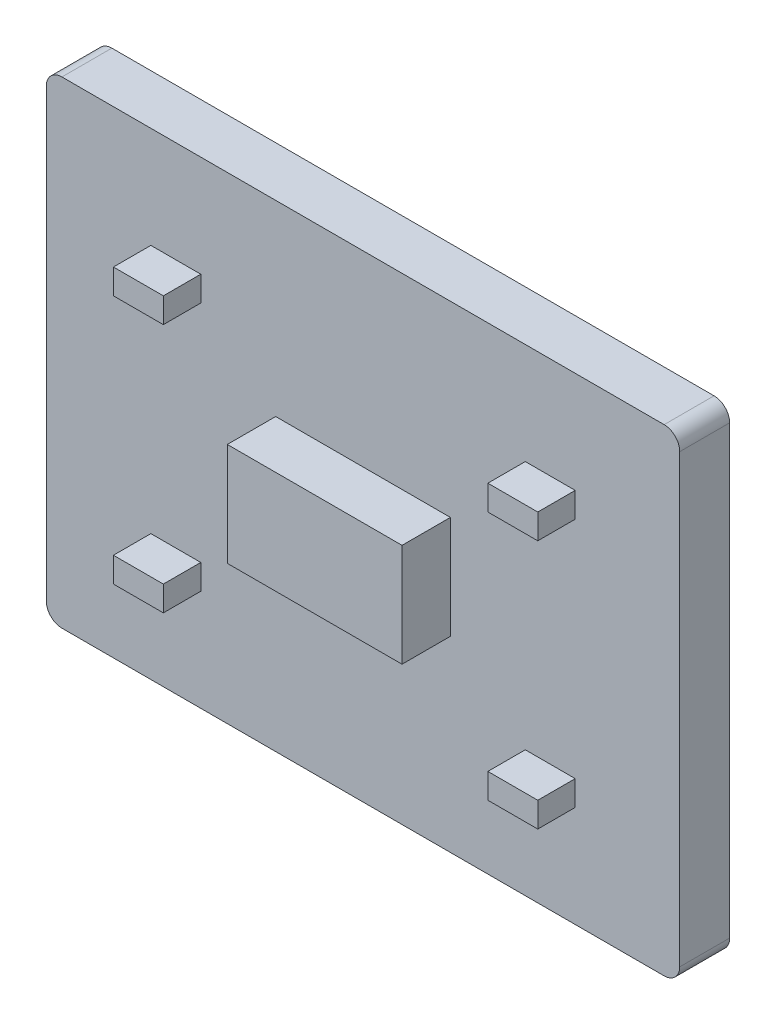
ISO-10303-21;
HEADER;
FILE_DESCRIPTION(('STEP AP214'),'2;1');
FILE_NAME('part.step','',(''),(''),'','','');
FILE_SCHEMA(('AUTOMOTIVE_DESIGN { 1 0 10303 214 1 1 1 1 }'));
ENDSEC;
DATA;
#1=APPLICATION_CONTEXT('core data for automotive mechanical design processes');
#2=APPLICATION_PROTOCOL_DEFINITION('international standard','automotive_design',2000,#1);
#3=PRODUCT_CONTEXT('',#1,'mechanical');
#4=PRODUCT('Part','Part','',(#3));
#5=PRODUCT_RELATED_PRODUCT_CATEGORY('part','',(#4));
#6=PRODUCT_DEFINITION_FORMATION('','',#4);
#7=PRODUCT_DEFINITION_CONTEXT('part definition',#1,'design');
#8=PRODUCT_DEFINITION('design','',#6,#7);
#9=PRODUCT_DEFINITION_SHAPE('','',#8);
#10=(LENGTH_UNIT() NAMED_UNIT(*) SI_UNIT(.MILLI.,.METRE.));
#11=(NAMED_UNIT(*) PLANE_ANGLE_UNIT() SI_UNIT($,.RADIAN.));
#12=(NAMED_UNIT(*) SI_UNIT($,.STERADIAN.) SOLID_ANGLE_UNIT());
#13=UNCERTAINTY_MEASURE_WITH_UNIT(LENGTH_MEASURE(1.E-05),#10,'distance_accuracy_value','');
#14=(GEOMETRIC_REPRESENTATION_CONTEXT(3) GLOBAL_UNCERTAINTY_ASSIGNED_CONTEXT((#13)) GLOBAL_UNIT_ASSIGNED_CONTEXT((#10,
#11,#12)) REPRESENTATION_CONTEXT('',''));
#15=CARTESIAN_POINT('',(0.,0.,0.));
#16=DIRECTION('',(0.,0.,1.));
#17=DIRECTION('',(1.,0.,0.));
#18=AXIS2_PLACEMENT_3D('',#15,#16,#17);
#19=CARTESIAN_POINT('',(19.35,3.85,-2.));
#20=DIRECTION('',(0.,0.,1.));
#21=DIRECTION('',(1.,0.,0.));
#22=AXIS2_PLACEMENT_3D('',#19,#20,#21);
#23=PLANE('',#22);
#24=DIRECTION('',(0.,-1.,0.));
#25=VECTOR('',#24,1.);
#26=CARTESIAN_POINT('',(26.2,12.65,-2.));
#27=LINE('',#26,#25);
#28=CARTESIAN_POINT('',(26.2,12.65,-2.));
#29=VERTEX_POINT('',#28);
#30=CARTESIAN_POINT('',(26.2,9.35,-2.));
#31=VERTEX_POINT('',#30);
#32=EDGE_CURVE('E347',#29,#31,#27,.T.);
#33=ORIENTED_EDGE('',*,*,#32,.F.);
#34=DIRECTION('',(-1.,0.,0.));
#35=VECTOR('',#34,1.);
#36=CARTESIAN_POINT('',(31.8,12.65,-2.));
#37=LINE('',#36,#35);
#38=CARTESIAN_POINT('',(31.8,12.65,-2.));
#39=VERTEX_POINT('',#38);
#40=EDGE_CURVE('E354',#39,#29,#37,.T.);
#41=ORIENTED_EDGE('',*,*,#40,.F.);
#42=DIRECTION('',(0.,1.,0.));
#43=VECTOR('',#42,1.);
#44=CARTESIAN_POINT('',(31.8,9.35,-2.));
#45=LINE('',#44,#43);
#46=CARTESIAN_POINT('',(31.8,9.35,-2.));
#47=VERTEX_POINT('',#46);
#48=EDGE_CURVE('E361',#47,#39,#45,.T.);
#49=ORIENTED_EDGE('',*,*,#48,.F.);
#50=DIRECTION('',(1.,0.,0.));
#51=VECTOR('',#50,1.);
#52=CARTESIAN_POINT('',(26.2,9.35,-2.));
#53=LINE('',#52,#51);
#54=EDGE_CURVE('E358',#31,#47,#53,.T.);
#55=ORIENTED_EDGE('',*,*,#54,.F.);
#56=EDGE_LOOP('',(#33,#41,#49,#55));
#57=FACE_BOUND('',#56,.T.);
#58=CARTESIAN_POINT('',(19.35,3.85,-2.));
#59=DIRECTION('',(0.,0.,1.));
#60=DIRECTION('',(1.,0.,0.));
#61=AXIS2_PLACEMENT_3D('',#58,#59,#60);
#62=CIRCLE('',#61,0.500000000000003);
#63=CARTESIAN_POINT('',(18.85,3.85,-2.));
#64=VERTEX_POINT('',#63);
#65=CARTESIAN_POINT('',(19.35,3.35,-2.));
#66=VERTEX_POINT('',#65);
#67=EDGE_CURVE('E377',#64,#66,#62,.T.);
#68=ORIENTED_EDGE('',*,*,#67,.T.);
#69=DIRECTION('',(1.,0.,0.));
#70=VECTOR('',#69,1.);
#71=CARTESIAN_POINT('',(19.35,3.35,-2.));
#72=LINE('',#71,#70);
#73=CARTESIAN_POINT('',(38.65,3.35,-2.));
#74=VERTEX_POINT('',#73);
#75=EDGE_CURVE('E406',#66,#74,#72,.T.);
#76=ORIENTED_EDGE('',*,*,#75,.T.);
#77=CARTESIAN_POINT('',(38.65,3.84999999999999,-2.));
#78=DIRECTION('',(0.,0.,1.));
#79=DIRECTION('',(1.,0.,0.));
#80=AXIS2_PLACEMENT_3D('',#77,#78,#79);
#81=CIRCLE('',#80,0.499999999999993);
#82=CARTESIAN_POINT('',(39.15,3.85,-2.));
#83=VERTEX_POINT('',#82);
#84=EDGE_CURVE('E407',#74,#83,#81,.T.);
#85=ORIENTED_EDGE('',*,*,#84,.T.);
#86=DIRECTION('',(0.,1.,0.));
#87=VECTOR('',#86,1.);
#88=CARTESIAN_POINT('',(39.15,3.85,-2.));
#89=LINE('',#88,#87);
#90=CARTESIAN_POINT('',(39.15,18.15,-2.));
#91=VERTEX_POINT('',#90);
#92=EDGE_CURVE('E414',#83,#91,#89,.T.);
#93=ORIENTED_EDGE('',*,*,#92,.T.);
#94=CARTESIAN_POINT('',(38.65,18.15,-2.));
#95=DIRECTION('',(0.,0.,1.));
#96=DIRECTION('',(1.,0.,0.));
#97=AXIS2_PLACEMENT_3D('',#94,#95,#96);
#98=CIRCLE('',#97,0.499999999999997);
#99=CARTESIAN_POINT('',(38.65,18.65,-2.));
#100=VERTEX_POINT('',#99);
#101=EDGE_CURVE('E418',#91,#100,#98,.T.);
#102=ORIENTED_EDGE('',*,*,#101,.T.);
#103=DIRECTION('',(-1.,0.,0.));
#104=VECTOR('',#103,1.);
#105=CARTESIAN_POINT('',(38.65,18.65,-2.));
#106=LINE('',#105,#104);
#107=CARTESIAN_POINT('',(19.35,18.65,-2.));
#108=VERTEX_POINT('',#107);
#109=EDGE_CURVE('E420',#100,#108,#106,.T.);
#110=ORIENTED_EDGE('',*,*,#109,.T.);
#111=CARTESIAN_POINT('',(19.35,18.15,-2.));
#112=DIRECTION('',(0.,0.,1.));
#113=DIRECTION('',(1.,0.,0.));
#114=AXIS2_PLACEMENT_3D('',#111,#112,#113);
#115=CIRCLE('',#114,0.500000000000007);
#116=CARTESIAN_POINT('',(18.85,18.15,-2.));
#117=VERTEX_POINT('',#116);
#118=EDGE_CURVE('E425',#108,#117,#115,.T.);
#119=ORIENTED_EDGE('',*,*,#118,.T.);
#120=DIRECTION('',(0.,-1.,0.));
#121=VECTOR('',#120,1.);
#122=CARTESIAN_POINT('',(18.85,18.15,-2.));
#123=LINE('',#122,#121);
#124=EDGE_CURVE('E383',#117,#64,#123,.T.);
#125=ORIENTED_EDGE('',*,*,#124,.T.);
#126=EDGE_LOOP('',(#68,#76,#85,#93,#102,#110,#119,#125));
#127=FACE_BOUND('',#126,.T.);
#128=DIRECTION('',(1.,0.,0.));
#129=VECTOR('',#128,1.);
#130=CARTESIAN_POINT('',(22.2,6.6,-2.));
#131=LINE('',#130,#129);
#132=CARTESIAN_POINT('',(22.2,6.6,-2.));
#133=VERTEX_POINT('',#132);
#134=CARTESIAN_POINT('',(23.8,6.6,-2.));
#135=VERTEX_POINT('',#134);
#136=EDGE_CURVE('E332',#133,#135,#131,.T.);
#137=ORIENTED_EDGE('',*,*,#136,.F.);
#138=DIRECTION('',(0.,-1.,0.));
#139=VECTOR('',#138,1.);
#140=CARTESIAN_POINT('',(22.2,7.4,-2.));
#141=LINE('',#140,#139);
#142=CARTESIAN_POINT('',(22.2,7.4,-2.));
#143=VERTEX_POINT('',#142);
#144=EDGE_CURVE('E290',#143,#133,#141,.T.);
#145=ORIENTED_EDGE('',*,*,#144,.F.);
#146=DIRECTION('',(-1.,0.,0.));
#147=VECTOR('',#146,1.);
#148=CARTESIAN_POINT('',(23.8,7.4,-2.));
#149=LINE('',#148,#147);
#150=CARTESIAN_POINT('',(23.8,7.4,-2.));
#151=VERTEX_POINT('',#150);
#152=EDGE_CURVE('E325',#151,#143,#149,.T.);
#153=ORIENTED_EDGE('',*,*,#152,.F.);
#154=DIRECTION('',(0.,1.,0.));
#155=VECTOR('',#154,1.);
#156=CARTESIAN_POINT('',(23.8,6.6,-2.));
#157=LINE('',#156,#155);
#158=EDGE_CURVE('E334',#135,#151,#157,.T.);
#159=ORIENTED_EDGE('',*,*,#158,.F.);
#160=EDGE_LOOP('',(#137,#145,#153,#159));
#161=FACE_BOUND('',#160,.T.);
#162=DIRECTION('',(1.,0.,0.));
#163=VECTOR('',#162,1.);
#164=CARTESIAN_POINT('',(34.2,14.6,-2.));
#165=LINE('',#164,#163);
#166=CARTESIAN_POINT('',(34.2,14.6,-2.));
#167=VERTEX_POINT('',#166);
#168=CARTESIAN_POINT('',(35.8,14.6,-2.));
#169=VERTEX_POINT('',#168);
#170=EDGE_CURVE('E252',#167,#169,#165,.T.);
#171=ORIENTED_EDGE('',*,*,#170,.F.);
#172=DIRECTION('',(0.,-1.,0.));
#173=VECTOR('',#172,1.);
#174=CARTESIAN_POINT('',(34.2,15.4,-2.));
#175=LINE('',#174,#173);
#176=CARTESIAN_POINT('',(34.2,15.4,-2.));
#177=VERTEX_POINT('',#176);
#178=EDGE_CURVE('E247',#177,#167,#175,.T.);
#179=ORIENTED_EDGE('',*,*,#178,.F.);
#180=DIRECTION('',(-1.,0.,0.));
#181=VECTOR('',#180,1.);
#182=CARTESIAN_POINT('',(35.8,15.4,-2.));
#183=LINE('',#182,#181);
#184=CARTESIAN_POINT('',(35.8,15.4,-2.));
#185=VERTEX_POINT('',#184);
#186=EDGE_CURVE('E226',#185,#177,#183,.T.);
#187=ORIENTED_EDGE('',*,*,#186,.F.);
#188=DIRECTION('',(0.,1.,0.));
#189=VECTOR('',#188,1.);
#190=CARTESIAN_POINT('',(35.8,14.6,-2.));
#191=LINE('',#190,#189);
#192=EDGE_CURVE('E239',#169,#185,#191,.T.);
#193=ORIENTED_EDGE('',*,*,#192,.F.);
#194=EDGE_LOOP('',(#171,#179,#187,#193));
#195=FACE_BOUND('',#194,.T.);
#196=DIRECTION('',(1.,0.,0.));
#197=VECTOR('',#196,1.);
#198=CARTESIAN_POINT('',(34.2,6.6,-2.));
#199=LINE('',#198,#197);
#200=CARTESIAN_POINT('',(34.2,6.6,-2.));
#201=VERTEX_POINT('',#200);
#202=CARTESIAN_POINT('',(35.8,6.6,-2.));
#203=VERTEX_POINT('',#202);
#204=EDGE_CURVE('E307',#201,#203,#199,.T.);
#205=ORIENTED_EDGE('',*,*,#204,.F.);
#206=DIRECTION('',(0.,-1.,0.));
#207=VECTOR('',#206,1.);
#208=CARTESIAN_POINT('',(34.2,7.4,-2.));
#209=LINE('',#208,#207);
#210=CARTESIAN_POINT('',(34.2,7.4,-2.));
#211=VERTEX_POINT('',#210);
#212=EDGE_CURVE('E267',#211,#201,#209,.T.);
#213=ORIENTED_EDGE('',*,*,#212,.F.);
#214=DIRECTION('',(-1.,0.,0.));
#215=VECTOR('',#214,1.);
#216=CARTESIAN_POINT('',(35.8,7.4,-2.));
#217=LINE('',#216,#215);
#218=CARTESIAN_POINT('',(35.8,7.4,-2.));
#219=VERTEX_POINT('',#218);
#220=EDGE_CURVE('E305',#219,#211,#217,.T.);
#221=ORIENTED_EDGE('',*,*,#220,.F.);
#222=DIRECTION('',(0.,1.,0.));
#223=VECTOR('',#222,1.);
#224=CARTESIAN_POINT('',(35.8,6.6,-2.));
#225=LINE('',#224,#223);
#226=EDGE_CURVE('E301',#203,#219,#225,.T.);
#227=ORIENTED_EDGE('',*,*,#226,.F.);
#228=EDGE_LOOP('',(#205,#213,#221,#227));
#229=FACE_BOUND('',#228,.T.);
#230=DIRECTION('',(1.,0.,0.));
#231=VECTOR('',#230,1.);
#232=CARTESIAN_POINT('',(22.2,14.6,-2.));
#233=LINE('',#232,#231);
#234=CARTESIAN_POINT('',(22.2,14.6,-2.));
#235=VERTEX_POINT('',#234);
#236=CARTESIAN_POINT('',(23.8,14.6,-2.));
#237=VERTEX_POINT('',#236);
#238=EDGE_CURVE('E281',#235,#237,#233,.T.);
#239=ORIENTED_EDGE('',*,*,#238,.F.);
#240=DIRECTION('',(0.,-1.,0.));
#241=VECTOR('',#240,1.);
#242=CARTESIAN_POINT('',(22.2,15.4,-2.));
#243=LINE('',#242,#241);
#244=CARTESIAN_POINT('',(22.2,15.4,-2.));
#245=VERTEX_POINT('',#244);
#246=EDGE_CURVE('E283',#245,#235,#243,.T.);
#247=ORIENTED_EDGE('',*,*,#246,.F.);
#248=DIRECTION('',(-1.,0.,0.));
#249=VECTOR('',#248,1.);
#250=CARTESIAN_POINT('',(23.8,15.4,-2.));
#251=LINE('',#250,#249);
#252=CARTESIAN_POINT('',(23.8,15.4,-2.));
#253=VERTEX_POINT('',#252);
#254=EDGE_CURVE('E280',#253,#245,#251,.T.);
#255=ORIENTED_EDGE('',*,*,#254,.F.);
#256=DIRECTION('',(0.,1.,0.));
#257=VECTOR('',#256,1.);
#258=CARTESIAN_POINT('',(23.8,14.6,-2.));
#259=LINE('',#258,#257);
#260=EDGE_CURVE('E276',#237,#253,#259,.T.);
#261=ORIENTED_EDGE('',*,*,#260,.F.);
#262=EDGE_LOOP('',(#239,#247,#255,#261));
#263=FACE_BOUND('',#262,.T.);
#264=ADVANCED_FACE('F39',(#57,#127,#161,#195,#229,#263),#23,.T.);
#265=CARTESIAN_POINT('',(19.35,3.85,-3.6));
#266=DIRECTION('',(0.,0.,1.));
#267=DIRECTION('',(1.,0.,0.));
#268=AXIS2_PLACEMENT_3D('',#265,#266,#267);
#269=CYLINDRICAL_SURFACE('',#268,0.500000000000003);
#270=ORIENTED_EDGE('',*,*,#67,.F.);
#271=DIRECTION('',(0.,0.,1.));
#272=VECTOR('',#271,1.);
#273=CARTESIAN_POINT('',(18.85,3.85,-3.6));
#274=LINE('',#273,#272);
#275=CARTESIAN_POINT('',(18.85,3.85,-3.6));
#276=VERTEX_POINT('',#275);
#277=EDGE_CURVE('E11',#276,#64,#274,.T.);
#278=ORIENTED_EDGE('',*,*,#277,.F.);
#279=CARTESIAN_POINT('',(19.35,3.85,-3.6));
#280=DIRECTION('',(0.,0.,1.));
#281=DIRECTION('',(1.,0.,0.));
#282=AXIS2_PLACEMENT_3D('',#279,#280,#281);
#283=CIRCLE('',#282,0.500000000000003);
#284=CARTESIAN_POINT('',(19.35,3.35,-3.6));
#285=VERTEX_POINT('',#284);
#286=EDGE_CURVE('E379',#276,#285,#283,.T.);
#287=ORIENTED_EDGE('',*,*,#286,.T.);
#288=DIRECTION('',(0.,0.,1.));
#289=VECTOR('',#288,1.);
#290=CARTESIAN_POINT('',(19.35,3.35,-3.6));
#291=LINE('',#290,#289);
#292=EDGE_CURVE('E43',#285,#66,#291,.T.);
#293=ORIENTED_EDGE('',*,*,#292,.T.);
#294=EDGE_LOOP('',(#270,#278,#287,#293));
#295=FACE_BOUND('',#294,.T.);
#296=ADVANCED_FACE('F41',(#295),#269,.T.);
#297=CARTESIAN_POINT('',(18.85,18.15,-3.6));
#298=DIRECTION('',(-1.,0.,0.));
#299=DIRECTION('',(0.,0.,1.));
#300=AXIS2_PLACEMENT_3D('',#297,#298,#299);
#301=PLANE('',#300);
#302=ORIENTED_EDGE('',*,*,#124,.F.);
#303=DIRECTION('',(0.,0.,1.));
#304=VECTOR('',#303,1.);
#305=CARTESIAN_POINT('',(18.85,18.15,-3.6));
#306=LINE('',#305,#304);
#307=CARTESIAN_POINT('',(18.85,18.15,-3.6));
#308=VERTEX_POINT('',#307);
#309=EDGE_CURVE('E48',#308,#117,#306,.T.);
#310=ORIENTED_EDGE('',*,*,#309,.F.);
#311=DIRECTION('',(0.,-1.,0.));
#312=VECTOR('',#311,1.);
#313=CARTESIAN_POINT('',(18.85,18.15,-3.6));
#314=LINE('',#313,#312);
#315=EDGE_CURVE('E405',#308,#276,#314,.T.);
#316=ORIENTED_EDGE('',*,*,#315,.T.);
#317=ORIENTED_EDGE('',*,*,#277,.T.);
#318=EDGE_LOOP('',(#302,#310,#316,#317));
#319=FACE_BOUND('',#318,.T.);
#320=ADVANCED_FACE('F448',(#319),#301,.T.);
#321=CARTESIAN_POINT('',(19.35,18.15,-3.6));
#322=DIRECTION('',(0.,0.,1.));
#323=DIRECTION('',(1.,0.,0.));
#324=AXIS2_PLACEMENT_3D('',#321,#322,#323);
#325=CYLINDRICAL_SURFACE('',#324,0.500000000000007);
#326=ORIENTED_EDGE('',*,*,#118,.F.);
#327=DIRECTION('',(0.,0.,1.));
#328=VECTOR('',#327,1.);
#329=CARTESIAN_POINT('',(19.35,18.65,-3.6));
#330=LINE('',#329,#328);
#331=CARTESIAN_POINT('',(19.35,18.65,-3.6));
#332=VERTEX_POINT('',#331);
#333=EDGE_CURVE('E428',#332,#108,#330,.T.);
#334=ORIENTED_EDGE('',*,*,#333,.F.);
#335=CARTESIAN_POINT('',(19.35,18.15,-3.6));
#336=DIRECTION('',(0.,0.,1.));
#337=DIRECTION('',(1.,0.,0.));
#338=AXIS2_PLACEMENT_3D('',#335,#336,#337);
#339=CIRCLE('',#338,0.500000000000007);
#340=EDGE_CURVE('E396',#332,#308,#339,.T.);
#341=ORIENTED_EDGE('',*,*,#340,.T.);
#342=ORIENTED_EDGE('',*,*,#309,.T.);
#343=EDGE_LOOP('',(#326,#334,#341,#342));
#344=FACE_BOUND('',#343,.T.);
#345=ADVANCED_FACE('F468',(#344),#325,.T.);
#346=CARTESIAN_POINT('',(38.65,18.65,-3.6));
#347=DIRECTION('',(0.,1.,0.));
#348=DIRECTION('',(0.,0.,1.));
#349=AXIS2_PLACEMENT_3D('',#346,#347,#348);
#350=PLANE('',#349);
#351=ORIENTED_EDGE('',*,*,#109,.F.);
#352=DIRECTION('',(0.,0.,1.));
#353=VECTOR('',#352,1.);
#354=CARTESIAN_POINT('',(38.65,18.65,-3.6));
#355=LINE('',#354,#353);
#356=CARTESIAN_POINT('',(38.65,18.65,-3.6));
#357=VERTEX_POINT('',#356);
#358=EDGE_CURVE('E429',#357,#100,#355,.T.);
#359=ORIENTED_EDGE('',*,*,#358,.F.);
#360=DIRECTION('',(-1.,0.,0.));
#361=VECTOR('',#360,1.);
#362=CARTESIAN_POINT('',(38.65,18.65,-3.6));
#363=LINE('',#362,#361);
#364=EDGE_CURVE('E397',#357,#332,#363,.T.);
#365=ORIENTED_EDGE('',*,*,#364,.T.);
#366=ORIENTED_EDGE('',*,*,#333,.T.);
#367=EDGE_LOOP('',(#351,#359,#365,#366));
#368=FACE_BOUND('',#367,.T.);
#369=ADVANCED_FACE('F469',(#368),#350,.T.);
#370=CARTESIAN_POINT('',(38.65,18.15,-3.6));
#371=DIRECTION('',(0.,0.,1.));
#372=DIRECTION('',(1.,0.,0.));
#373=AXIS2_PLACEMENT_3D('',#370,#371,#372);
#374=CYLINDRICAL_SURFACE('',#373,0.499999999999997);
#375=ORIENTED_EDGE('',*,*,#101,.F.);
#376=DIRECTION('',(0.,0.,1.));
#377=VECTOR('',#376,1.);
#378=CARTESIAN_POINT('',(39.15,18.15,-3.6));
#379=LINE('',#378,#377);
#380=CARTESIAN_POINT('',(39.15,18.15,-3.6));
#381=VERTEX_POINT('',#380);
#382=EDGE_CURVE('E435',#381,#91,#379,.T.);
#383=ORIENTED_EDGE('',*,*,#382,.F.);
#384=CARTESIAN_POINT('',(38.65,18.15,-3.6));
#385=DIRECTION('',(0.,0.,1.));
#386=DIRECTION('',(1.,0.,0.));
#387=AXIS2_PLACEMENT_3D('',#384,#385,#386);
#388=CIRCLE('',#387,0.499999999999997);
#389=EDGE_CURVE('E395',#381,#357,#388,.T.);
#390=ORIENTED_EDGE('',*,*,#389,.T.);
#391=ORIENTED_EDGE('',*,*,#358,.T.);
#392=EDGE_LOOP('',(#375,#383,#390,#391));
#393=FACE_BOUND('',#392,.T.);
#394=ADVANCED_FACE('F463',(#393),#374,.T.);
#395=CARTESIAN_POINT('',(39.15,3.85,-3.6));
#396=DIRECTION('',(1.,0.,0.));
#397=DIRECTION('',(0.,0.,-1.));
#398=AXIS2_PLACEMENT_3D('',#395,#396,#397);
#399=PLANE('',#398);
#400=ORIENTED_EDGE('',*,*,#92,.F.);
#401=DIRECTION('',(0.,0.,1.));
#402=VECTOR('',#401,1.);
#403=CARTESIAN_POINT('',(39.15,3.85,-3.6));
#404=LINE('',#403,#402);
#405=CARTESIAN_POINT('',(39.15,3.85,-3.6));
#406=VERTEX_POINT('',#405);
#407=EDGE_CURVE('E432',#406,#83,#404,.T.);
#408=ORIENTED_EDGE('',*,*,#407,.F.);
#409=DIRECTION('',(0.,1.,0.));
#410=VECTOR('',#409,1.);
#411=CARTESIAN_POINT('',(39.15,3.85,-3.6));
#412=LINE('',#411,#410);
#413=EDGE_CURVE('E388',#406,#381,#412,.T.);
#414=ORIENTED_EDGE('',*,*,#413,.T.);
#415=ORIENTED_EDGE('',*,*,#382,.T.);
#416=EDGE_LOOP('',(#400,#408,#414,#415));
#417=FACE_BOUND('',#416,.T.);
#418=ADVANCED_FACE('F461',(#417),#399,.T.);
#419=CARTESIAN_POINT('',(38.65,3.84999999999999,-3.6));
#420=DIRECTION('',(0.,0.,1.));
#421=DIRECTION('',(1.,0.,0.));
#422=AXIS2_PLACEMENT_3D('',#419,#420,#421);
#423=CYLINDRICAL_SURFACE('',#422,0.499999999999993);
#424=ORIENTED_EDGE('',*,*,#84,.F.);
#425=DIRECTION('',(0.,0.,1.));
#426=VECTOR('',#425,1.);
#427=CARTESIAN_POINT('',(38.65,3.35,-3.6));
#428=LINE('',#427,#426);
#429=CARTESIAN_POINT('',(38.65,3.35,-3.6));
#430=VERTEX_POINT('',#429);
#431=EDGE_CURVE('E434',#430,#74,#428,.T.);
#432=ORIENTED_EDGE('',*,*,#431,.F.);
#433=CARTESIAN_POINT('',(38.65,3.84999999999999,-3.6));
#434=DIRECTION('',(0.,0.,1.));
#435=DIRECTION('',(1.,0.,0.));
#436=AXIS2_PLACEMENT_3D('',#433,#434,#435);
#437=CIRCLE('',#436,0.499999999999993);
#438=EDGE_CURVE('E390',#430,#406,#437,.T.);
#439=ORIENTED_EDGE('',*,*,#438,.T.);
#440=ORIENTED_EDGE('',*,*,#407,.T.);
#441=EDGE_LOOP('',(#424,#432,#439,#440));
#442=FACE_BOUND('',#441,.T.);
#443=ADVANCED_FACE('F456',(#442),#423,.T.);
#444=CARTESIAN_POINT('',(19.35,3.35,-3.6));
#445=DIRECTION('',(0.,-1.,0.));
#446=DIRECTION('',(0.,0.,-1.));
#447=AXIS2_PLACEMENT_3D('',#444,#445,#446);
#448=PLANE('',#447);
#449=ORIENTED_EDGE('',*,*,#75,.F.);
#450=ORIENTED_EDGE('',*,*,#292,.F.);
#451=DIRECTION('',(1.,0.,0.));
#452=VECTOR('',#451,1.);
#453=CARTESIAN_POINT('',(19.35,3.35,-3.6));
#454=LINE('',#453,#452);
#455=EDGE_CURVE('E382',#285,#430,#454,.T.);
#456=ORIENTED_EDGE('',*,*,#455,.T.);
#457=ORIENTED_EDGE('',*,*,#431,.T.);
#458=EDGE_LOOP('',(#449,#450,#456,#457));
#459=FACE_BOUND('',#458,.T.);
#460=ADVANCED_FACE('F444',(#459),#448,.T.);
#461=CARTESIAN_POINT('',(19.35,3.85,-3.6));
#462=DIRECTION('',(0.,0.,1.));
#463=DIRECTION('',(1.,0.,0.));
#464=AXIS2_PLACEMENT_3D('',#461,#462,#463);
#465=PLANE('',#464);
#466=ORIENTED_EDGE('',*,*,#286,.F.);
#467=ORIENTED_EDGE('',*,*,#315,.F.);
#468=ORIENTED_EDGE('',*,*,#340,.F.);
#469=ORIENTED_EDGE('',*,*,#364,.F.);
#470=ORIENTED_EDGE('',*,*,#389,.F.);
#471=ORIENTED_EDGE('',*,*,#413,.F.);
#472=ORIENTED_EDGE('',*,*,#438,.F.);
#473=ORIENTED_EDGE('',*,*,#455,.F.);
#474=EDGE_LOOP('',(#466,#467,#468,#469,#470,#471,#472,#473));
#475=FACE_BOUND('',#474,.T.);
#476=ADVANCED_FACE('F455',(#475),#465,.F.);
#477=CARTESIAN_POINT('',(26.2,12.65,-0.45));
#478=DIRECTION('',(1.,0.,0.));
#479=DIRECTION('',(0.,0.,-1.));
#480=AXIS2_PLACEMENT_3D('',#477,#478,#479);
#481=PLANE('',#480);
#482=ORIENTED_EDGE('',*,*,#32,.T.);
#483=DIRECTION('',(0.,0.,-1.));
#484=VECTOR('',#483,1.);
#485=CARTESIAN_POINT('',(26.2,9.35,-0.45));
#486=LINE('',#485,#484);
#487=CARTESIAN_POINT('',(26.2,9.35,-0.45));
#488=VERTEX_POINT('',#487);
#489=EDGE_CURVE('E376',#488,#31,#486,.T.);
#490=ORIENTED_EDGE('',*,*,#489,.F.);
#491=DIRECTION('',(0.,-1.,0.));
#492=VECTOR('',#491,1.);
#493=CARTESIAN_POINT('',(26.2,12.65,-0.45));
#494=LINE('',#493,#492);
#495=CARTESIAN_POINT('',(26.2,12.65,-0.45));
#496=VERTEX_POINT('',#495);
#497=EDGE_CURVE('E350',#496,#488,#494,.T.);
#498=ORIENTED_EDGE('',*,*,#497,.F.);
#499=DIRECTION('',(0.,0.,-1.));
#500=VECTOR('',#499,1.);
#501=CARTESIAN_POINT('',(26.2,12.65,-0.45));
#502=LINE('',#501,#500);
#503=EDGE_CURVE('E360',#496,#29,#502,.T.);
#504=ORIENTED_EDGE('',*,*,#503,.T.);
#505=EDGE_LOOP('',(#482,#490,#498,#504));
#506=FACE_BOUND('',#505,.T.);
#507=ADVANCED_FACE('F489',(#506),#481,.F.);
#508=CARTESIAN_POINT('',(26.2,9.35,-0.45));
#509=DIRECTION('',(0.,1.,0.));
#510=DIRECTION('',(0.,0.,1.));
#511=AXIS2_PLACEMENT_3D('',#508,#509,#510);
#512=PLANE('',#511);
#513=ORIENTED_EDGE('',*,*,#54,.T.);
#514=DIRECTION('',(0.,0.,-1.));
#515=VECTOR('',#514,1.);
#516=CARTESIAN_POINT('',(31.8,9.35,-0.45));
#517=LINE('',#516,#515);
#518=CARTESIAN_POINT('',(31.8,9.35,-0.45));
#519=VERTEX_POINT('',#518);
#520=EDGE_CURVE('E373',#519,#47,#517,.T.);
#521=ORIENTED_EDGE('',*,*,#520,.F.);
#522=DIRECTION('',(1.,0.,0.));
#523=VECTOR('',#522,1.);
#524=CARTESIAN_POINT('',(26.2,9.35,-0.45));
#525=LINE('',#524,#523);
#526=EDGE_CURVE('E348',#488,#519,#525,.T.);
#527=ORIENTED_EDGE('',*,*,#526,.F.);
#528=ORIENTED_EDGE('',*,*,#489,.T.);
#529=EDGE_LOOP('',(#513,#521,#527,#528));
#530=FACE_BOUND('',#529,.T.);
#531=ADVANCED_FACE('F492',(#530),#512,.F.);
#532=CARTESIAN_POINT('',(31.8,9.35,-0.45));
#533=DIRECTION('',(-1.,0.,0.));
#534=DIRECTION('',(0.,0.,1.));
#535=AXIS2_PLACEMENT_3D('',#532,#533,#534);
#536=PLANE('',#535);
#537=ORIENTED_EDGE('',*,*,#48,.T.);
#538=DIRECTION('',(0.,0.,-1.));
#539=VECTOR('',#538,1.);
#540=CARTESIAN_POINT('',(31.8,12.65,-0.45));
#541=LINE('',#540,#539);
#542=CARTESIAN_POINT('',(31.8,12.65,-0.45));
#543=VERTEX_POINT('',#542);
#544=EDGE_CURVE('E367',#543,#39,#541,.T.);
#545=ORIENTED_EDGE('',*,*,#544,.F.);
#546=DIRECTION('',(0.,1.,0.));
#547=VECTOR('',#546,1.);
#548=CARTESIAN_POINT('',(31.8,9.35,-0.45));
#549=LINE('',#548,#547);
#550=EDGE_CURVE('E355',#519,#543,#549,.T.);
#551=ORIENTED_EDGE('',*,*,#550,.F.);
#552=ORIENTED_EDGE('',*,*,#520,.T.);
#553=EDGE_LOOP('',(#537,#545,#551,#552));
#554=FACE_BOUND('',#553,.T.);
#555=ADVANCED_FACE('F500',(#554),#536,.F.);
#556=CARTESIAN_POINT('',(31.8,12.65,-0.45));
#557=DIRECTION('',(0.,-1.,0.));
#558=DIRECTION('',(0.,0.,-1.));
#559=AXIS2_PLACEMENT_3D('',#556,#557,#558);
#560=PLANE('',#559);
#561=ORIENTED_EDGE('',*,*,#40,.T.);
#562=ORIENTED_EDGE('',*,*,#503,.F.);
#563=DIRECTION('',(-1.,0.,0.));
#564=VECTOR('',#563,1.);
#565=CARTESIAN_POINT('',(31.8,12.65,-0.45));
#566=LINE('',#565,#564);
#567=EDGE_CURVE('E352',#543,#496,#566,.T.);
#568=ORIENTED_EDGE('',*,*,#567,.F.);
#569=ORIENTED_EDGE('',*,*,#544,.T.);
#570=EDGE_LOOP('',(#561,#562,#568,#569));
#571=FACE_BOUND('',#570,.T.);
#572=ADVANCED_FACE('F504',(#571),#560,.F.);
#573=CARTESIAN_POINT('',(0.,0.,-0.45));
#574=DIRECTION('',(0.,0.,1.));
#575=DIRECTION('',(1.,0.,0.));
#576=AXIS2_PLACEMENT_3D('',#573,#574,#575);
#577=PLANE('',#576);
#578=ORIENTED_EDGE('',*,*,#497,.T.);
#579=ORIENTED_EDGE('',*,*,#526,.T.);
#580=ORIENTED_EDGE('',*,*,#550,.T.);
#581=ORIENTED_EDGE('',*,*,#567,.T.);
#582=EDGE_LOOP('',(#578,#579,#580,#581));
#583=FACE_BOUND('',#582,.T.);
#584=ADVANCED_FACE('F502',(#583),#577,.T.);
#585=CARTESIAN_POINT('',(22.2,7.4,-0.8));
#586=DIRECTION('',(1.,0.,0.));
#587=DIRECTION('',(0.,0.,-1.));
#588=AXIS2_PLACEMENT_3D('',#585,#586,#587);
#589=PLANE('',#588);
#590=ORIENTED_EDGE('',*,*,#144,.T.);
#591=DIRECTION('',(0.,0.,-1.));
#592=VECTOR('',#591,1.);
#593=CARTESIAN_POINT('',(22.2,6.6,-0.8));
#594=LINE('',#593,#592);
#595=CARTESIAN_POINT('',(22.2,6.6,-0.8));
#596=VERTEX_POINT('',#595);
#597=EDGE_CURVE('E341',#596,#133,#594,.T.);
#598=ORIENTED_EDGE('',*,*,#597,.F.);
#599=DIRECTION('',(0.,-1.,0.));
#600=VECTOR('',#599,1.);
#601=CARTESIAN_POINT('',(22.2,7.4,-0.8));
#602=LINE('',#601,#600);
#603=CARTESIAN_POINT('',(22.2,7.4,-0.8));
#604=VERTEX_POINT('',#603);
#605=EDGE_CURVE('E318',#604,#596,#602,.T.);
#606=ORIENTED_EDGE('',*,*,#605,.F.);
#607=DIRECTION('',(0.,0.,-1.));
#608=VECTOR('',#607,1.);
#609=CARTESIAN_POINT('',(22.2,7.4,-0.8));
#610=LINE('',#609,#608);
#611=EDGE_CURVE('E327',#604,#143,#610,.T.);
#612=ORIENTED_EDGE('',*,*,#611,.T.);
#613=EDGE_LOOP('',(#590,#598,#606,#612));
#614=FACE_BOUND('',#613,.T.);
#615=ADVANCED_FACE('F509',(#614),#589,.F.);
#616=CARTESIAN_POINT('',(22.2,6.6,-0.8));
#617=DIRECTION('',(0.,1.,0.));
#618=DIRECTION('',(0.,0.,1.));
#619=AXIS2_PLACEMENT_3D('',#616,#617,#618);
#620=PLANE('',#619);
#621=ORIENTED_EDGE('',*,*,#136,.T.);
#622=DIRECTION('',(0.,0.,-1.));
#623=VECTOR('',#622,1.);
#624=CARTESIAN_POINT('',(23.8,6.6,-0.8));
#625=LINE('',#624,#623);
#626=CARTESIAN_POINT('',(23.8,6.6,-0.8));
#627=VERTEX_POINT('',#626);
#628=EDGE_CURVE('E342',#627,#135,#625,.T.);
#629=ORIENTED_EDGE('',*,*,#628,.F.);
#630=DIRECTION('',(1.,0.,0.));
#631=VECTOR('',#630,1.);
#632=CARTESIAN_POINT('',(22.2,6.6,-0.8));
#633=LINE('',#632,#631);
#634=EDGE_CURVE('E321',#596,#627,#633,.T.);
#635=ORIENTED_EDGE('',*,*,#634,.F.);
#636=ORIENTED_EDGE('',*,*,#597,.T.);
#637=EDGE_LOOP('',(#621,#629,#635,#636));
#638=FACE_BOUND('',#637,.T.);
#639=ADVANCED_FACE('F512',(#638),#620,.F.);
#640=CARTESIAN_POINT('',(23.8,6.6,-0.8));
#641=DIRECTION('',(-1.,0.,0.));
#642=DIRECTION('',(0.,0.,1.));
#643=AXIS2_PLACEMENT_3D('',#640,#641,#642);
#644=PLANE('',#643);
#645=ORIENTED_EDGE('',*,*,#158,.T.);
#646=DIRECTION('',(0.,0.,-1.));
#647=VECTOR('',#646,1.);
#648=CARTESIAN_POINT('',(23.8,7.4,-0.8));
#649=LINE('',#648,#647);
#650=CARTESIAN_POINT('',(23.8,7.4,-0.8));
#651=VERTEX_POINT('',#650);
#652=EDGE_CURVE('E338',#651,#151,#649,.T.);
#653=ORIENTED_EDGE('',*,*,#652,.F.);
#654=DIRECTION('',(0.,1.,0.));
#655=VECTOR('',#654,1.);
#656=CARTESIAN_POINT('',(23.8,6.6,-0.8));
#657=LINE('',#656,#655);
#658=EDGE_CURVE('E322',#627,#651,#657,.T.);
#659=ORIENTED_EDGE('',*,*,#658,.F.);
#660=ORIENTED_EDGE('',*,*,#628,.T.);
#661=EDGE_LOOP('',(#645,#653,#659,#660));
#662=FACE_BOUND('',#661,.T.);
#663=ADVANCED_FACE('F513',(#662),#644,.F.);
#664=CARTESIAN_POINT('',(23.8,7.4,-0.8));
#665=DIRECTION('',(0.,-1.,0.));
#666=DIRECTION('',(0.,0.,-1.));
#667=AXIS2_PLACEMENT_3D('',#664,#665,#666);
#668=PLANE('',#667);
#669=ORIENTED_EDGE('',*,*,#152,.T.);
#670=ORIENTED_EDGE('',*,*,#611,.F.);
#671=DIRECTION('',(-1.,0.,0.));
#672=VECTOR('',#671,1.);
#673=CARTESIAN_POINT('',(23.8,7.4,-0.8));
#674=LINE('',#673,#672);
#675=EDGE_CURVE('E326',#651,#604,#674,.T.);
#676=ORIENTED_EDGE('',*,*,#675,.F.);
#677=ORIENTED_EDGE('',*,*,#652,.T.);
#678=EDGE_LOOP('',(#669,#670,#676,#677));
#679=FACE_BOUND('',#678,.T.);
#680=ADVANCED_FACE('F518',(#679),#668,.F.);
#681=CARTESIAN_POINT('',(0.,0.,-0.8));
#682=DIRECTION('',(0.,0.,1.));
#683=DIRECTION('',(1.,0.,0.));
#684=AXIS2_PLACEMENT_3D('',#681,#682,#683);
#685=PLANE('',#684);
#686=ORIENTED_EDGE('',*,*,#605,.T.);
#687=ORIENTED_EDGE('',*,*,#634,.T.);
#688=ORIENTED_EDGE('',*,*,#658,.T.);
#689=ORIENTED_EDGE('',*,*,#675,.T.);
#690=EDGE_LOOP('',(#686,#687,#688,#689));
#691=FACE_BOUND('',#690,.T.);
#692=ADVANCED_FACE('F524',(#691),#685,.T.);
#693=CARTESIAN_POINT('',(34.2,15.4,-0.8));
#694=DIRECTION('',(1.,0.,0.));
#695=DIRECTION('',(0.,0.,-1.));
#696=AXIS2_PLACEMENT_3D('',#693,#694,#695);
#697=PLANE('',#696);
#698=ORIENTED_EDGE('',*,*,#178,.T.);
#699=DIRECTION('',(0.,0.,-1.));
#700=VECTOR('',#699,1.);
#701=CARTESIAN_POINT('',(34.2,14.6,-0.8));
#702=LINE('',#701,#700);
#703=CARTESIAN_POINT('',(34.2,14.6,-0.8));
#704=VERTEX_POINT('',#703);
#705=EDGE_CURVE('E799',#704,#167,#702,.T.);
#706=ORIENTED_EDGE('',*,*,#705,.F.);
#707=DIRECTION('',(0.,-1.,0.));
#708=VECTOR('',#707,1.);
#709=CARTESIAN_POINT('',(34.2,15.4,-0.8));
#710=LINE('',#709,#708);
#711=CARTESIAN_POINT('',(34.2,15.4,-0.8));
#712=VERTEX_POINT('',#711);
#713=EDGE_CURVE('E238',#712,#704,#710,.T.);
#714=ORIENTED_EDGE('',*,*,#713,.F.);
#715=DIRECTION('',(0.,0.,-1.));
#716=VECTOR('',#715,1.);
#717=CARTESIAN_POINT('',(34.2,15.4,-0.8));
#718=LINE('',#717,#716);
#719=EDGE_CURVE('E232',#712,#177,#718,.T.);
#720=ORIENTED_EDGE('',*,*,#719,.T.);
#721=EDGE_LOOP('',(#698,#706,#714,#720));
#722=FACE_BOUND('',#721,.T.);
#723=ADVANCED_FACE('F243',(#722),#697,.F.);
#724=CARTESIAN_POINT('',(34.2,14.6,-0.8));
#725=DIRECTION('',(0.,1.,0.));
#726=DIRECTION('',(0.,0.,1.));
#727=AXIS2_PLACEMENT_3D('',#724,#725,#726);
#728=PLANE('',#727);
#729=ORIENTED_EDGE('',*,*,#170,.T.);
#730=DIRECTION('',(0.,0.,-1.));
#731=VECTOR('',#730,1.);
#732=CARTESIAN_POINT('',(35.8,14.6,-0.8));
#733=LINE('',#732,#731);
#734=CARTESIAN_POINT('',(35.8,14.6,-0.8));
#735=VERTEX_POINT('',#734);
#736=EDGE_CURVE('E797',#735,#169,#733,.T.);
#737=ORIENTED_EDGE('',*,*,#736,.F.);
#738=DIRECTION('',(1.,0.,0.));
#739=VECTOR('',#738,1.);
#740=CARTESIAN_POINT('',(34.2,14.6,-0.8));
#741=LINE('',#740,#739);
#742=EDGE_CURVE('E263',#704,#735,#741,.T.);
#743=ORIENTED_EDGE('',*,*,#742,.F.);
#744=ORIENTED_EDGE('',*,*,#705,.T.);
#745=EDGE_LOOP('',(#729,#737,#743,#744));
#746=FACE_BOUND('',#745,.T.);
#747=ADVANCED_FACE('F572',(#746),#728,.F.);
#748=CARTESIAN_POINT('',(35.8,14.6,-0.8));
#749=DIRECTION('',(-1.,0.,0.));
#750=DIRECTION('',(0.,0.,1.));
#751=AXIS2_PLACEMENT_3D('',#748,#749,#750);
#752=PLANE('',#751);
#753=ORIENTED_EDGE('',*,*,#192,.T.);
#754=DIRECTION('',(0.,0.,-1.));
#755=VECTOR('',#754,1.);
#756=CARTESIAN_POINT('',(35.8,15.4,-0.8));
#757=LINE('',#756,#755);
#758=CARTESIAN_POINT('',(35.8,15.4,-0.8));
#759=VERTEX_POINT('',#758);
#760=EDGE_CURVE('E231',#759,#185,#757,.T.);
#761=ORIENTED_EDGE('',*,*,#760,.F.);
#762=DIRECTION('',(0.,1.,0.));
#763=VECTOR('',#762,1.);
#764=CARTESIAN_POINT('',(35.8,14.6,-0.8));
#765=LINE('',#764,#763);
#766=EDGE_CURVE('E261',#735,#759,#765,.T.);
#767=ORIENTED_EDGE('',*,*,#766,.F.);
#768=ORIENTED_EDGE('',*,*,#736,.T.);
#769=EDGE_LOOP('',(#753,#761,#767,#768));
#770=FACE_BOUND('',#769,.T.);
#771=ADVANCED_FACE('F571',(#770),#752,.F.);
#772=CARTESIAN_POINT('',(35.8,15.4,-0.8));
#773=DIRECTION('',(0.,-1.,0.));
#774=DIRECTION('',(0.,0.,-1.));
#775=AXIS2_PLACEMENT_3D('',#772,#773,#774);
#776=PLANE('',#775);
#777=ORIENTED_EDGE('',*,*,#186,.T.);
#778=ORIENTED_EDGE('',*,*,#719,.F.);
#779=DIRECTION('',(-1.,0.,0.));
#780=VECTOR('',#779,1.);
#781=CARTESIAN_POINT('',(35.8,15.4,-0.8));
#782=LINE('',#781,#780);
#783=EDGE_CURVE('E246',#759,#712,#782,.T.);
#784=ORIENTED_EDGE('',*,*,#783,.F.);
#785=ORIENTED_EDGE('',*,*,#760,.T.);
#786=EDGE_LOOP('',(#777,#778,#784,#785));
#787=FACE_BOUND('',#786,.T.);
#788=ADVANCED_FACE('F228',(#787),#776,.F.);
#789=CARTESIAN_POINT('',(0.,0.,-0.8));
#790=DIRECTION('',(0.,0.,1.));
#791=DIRECTION('',(1.,0.,0.));
#792=AXIS2_PLACEMENT_3D('',#789,#790,#791);
#793=PLANE('',#792);
#794=ORIENTED_EDGE('',*,*,#713,.T.);
#795=ORIENTED_EDGE('',*,*,#742,.T.);
#796=ORIENTED_EDGE('',*,*,#766,.T.);
#797=ORIENTED_EDGE('',*,*,#783,.T.);
#798=EDGE_LOOP('',(#794,#795,#796,#797));
#799=FACE_BOUND('',#798,.T.);
#800=ADVANCED_FACE('F550',(#799),#793,.T.);
#801=CARTESIAN_POINT('',(34.2,7.4,-0.8));
#802=DIRECTION('',(1.,0.,0.));
#803=DIRECTION('',(0.,0.,-1.));
#804=AXIS2_PLACEMENT_3D('',#801,#802,#803);
#805=PLANE('',#804);
#806=ORIENTED_EDGE('',*,*,#212,.T.);
#807=DIRECTION('',(0.,0.,-1.));
#808=VECTOR('',#807,1.);
#809=CARTESIAN_POINT('',(34.2,6.6,-0.8));
#810=LINE('',#809,#808);
#811=CARTESIAN_POINT('',(34.2,6.6,-0.8));
#812=VERTEX_POINT('',#811);
#813=EDGE_CURVE('E251',#812,#201,#810,.T.);
#814=ORIENTED_EDGE('',*,*,#813,.F.);
#815=DIRECTION('',(0.,-1.,0.));
#816=VECTOR('',#815,1.);
#817=CARTESIAN_POINT('',(34.2,7.4,-0.8));
#818=LINE('',#817,#816);
#819=CARTESIAN_POINT('',(34.2,7.4,-0.8));
#820=VERTEX_POINT('',#819);
#821=EDGE_CURVE('E303',#820,#812,#818,.T.);
#822=ORIENTED_EDGE('',*,*,#821,.F.);
#823=DIRECTION('',(0.,0.,-1.));
#824=VECTOR('',#823,1.);
#825=CARTESIAN_POINT('',(34.2,7.4,-0.8));
#826=LINE('',#825,#824);
#827=EDGE_CURVE('E300',#820,#211,#826,.T.);
#828=ORIENTED_EDGE('',*,*,#827,.T.);
#829=EDGE_LOOP('',(#806,#814,#822,#828));
#830=FACE_BOUND('',#829,.T.);
#831=ADVANCED_FACE('F543',(#830),#805,.F.);
#832=CARTESIAN_POINT('',(34.2,6.6,-0.8));
#833=DIRECTION('',(0.,1.,0.));
#834=DIRECTION('',(0.,0.,1.));
#835=AXIS2_PLACEMENT_3D('',#832,#833,#834);
#836=PLANE('',#835);
#837=ORIENTED_EDGE('',*,*,#204,.T.);
#838=DIRECTION('',(0.,0.,-1.));
#839=VECTOR('',#838,1.);
#840=CARTESIAN_POINT('',(35.8,6.6,-0.8));
#841=LINE('',#840,#839);
#842=CARTESIAN_POINT('',(35.8,6.6,-0.8));
#843=VERTEX_POINT('',#842);
#844=EDGE_CURVE('E254',#843,#203,#841,.T.);
#845=ORIENTED_EDGE('',*,*,#844,.F.);
#846=DIRECTION('',(1.,0.,0.));
#847=VECTOR('',#846,1.);
#848=CARTESIAN_POINT('',(34.2,6.6,-0.8));
#849=LINE('',#848,#847);
#850=EDGE_CURVE('E314',#812,#843,#849,.T.);
#851=ORIENTED_EDGE('',*,*,#850,.F.);
#852=ORIENTED_EDGE('',*,*,#813,.T.);
#853=EDGE_LOOP('',(#837,#845,#851,#852));
#854=FACE_BOUND('',#853,.T.);
#855=ADVANCED_FACE('F537',(#854),#836,.F.);
#856=CARTESIAN_POINT('',(35.8,6.6,-0.8));
#857=DIRECTION('',(-1.,0.,0.));
#858=DIRECTION('',(0.,0.,1.));
#859=AXIS2_PLACEMENT_3D('',#856,#857,#858);
#860=PLANE('',#859);
#861=ORIENTED_EDGE('',*,*,#226,.T.);
#862=DIRECTION('',(0.,0.,-1.));
#863=VECTOR('',#862,1.);
#864=CARTESIAN_POINT('',(35.8,7.4,-0.8));
#865=LINE('',#864,#863);
#866=CARTESIAN_POINT('',(35.8,7.4,-0.8));
#867=VERTEX_POINT('',#866);
#868=EDGE_CURVE('E63',#867,#219,#865,.T.);
#869=ORIENTED_EDGE('',*,*,#868,.F.);
#870=DIRECTION('',(0.,1.,0.));
#871=VECTOR('',#870,1.);
#872=CARTESIAN_POINT('',(35.8,6.6,-0.8));
#873=LINE('',#872,#871);
#874=EDGE_CURVE('E315',#843,#867,#873,.T.);
#875=ORIENTED_EDGE('',*,*,#874,.F.);
#876=ORIENTED_EDGE('',*,*,#844,.T.);
#877=EDGE_LOOP('',(#861,#869,#875,#876));
#878=FACE_BOUND('',#877,.T.);
#879=ADVANCED_FACE('F536',(#878),#860,.F.);
#880=CARTESIAN_POINT('',(35.8,7.4,-0.8));
#881=DIRECTION('',(0.,-1.,0.));
#882=DIRECTION('',(0.,0.,-1.));
#883=AXIS2_PLACEMENT_3D('',#880,#881,#882);
#884=PLANE('',#883);
#885=ORIENTED_EDGE('',*,*,#220,.T.);
#886=ORIENTED_EDGE('',*,*,#827,.F.);
#887=DIRECTION('',(-1.,0.,0.));
#888=VECTOR('',#887,1.);
#889=CARTESIAN_POINT('',(35.8,7.4,-0.8));
#890=LINE('',#889,#888);
#891=EDGE_CURVE('E302',#867,#820,#890,.T.);
#892=ORIENTED_EDGE('',*,*,#891,.F.);
#893=ORIENTED_EDGE('',*,*,#868,.T.);
#894=EDGE_LOOP('',(#885,#886,#892,#893));
#895=FACE_BOUND('',#894,.T.);
#896=ADVANCED_FACE('F535',(#895),#884,.F.);
#897=CARTESIAN_POINT('',(0.,0.,-0.8));
#898=DIRECTION('',(0.,0.,1.));
#899=DIRECTION('',(1.,0.,0.));
#900=AXIS2_PLACEMENT_3D('',#897,#898,#899);
#901=PLANE('',#900);
#902=ORIENTED_EDGE('',*,*,#821,.T.);
#903=ORIENTED_EDGE('',*,*,#850,.T.);
#904=ORIENTED_EDGE('',*,*,#874,.T.);
#905=ORIENTED_EDGE('',*,*,#891,.T.);
#906=EDGE_LOOP('',(#902,#903,#904,#905));
#907=FACE_BOUND('',#906,.T.);
#908=ADVANCED_FACE('F526',(#907),#901,.T.);
#909=CARTESIAN_POINT('',(22.2,15.4,-0.8));
#910=DIRECTION('',(1.,0.,0.));
#911=DIRECTION('',(0.,0.,-1.));
#912=AXIS2_PLACEMENT_3D('',#909,#910,#911);
#913=PLANE('',#912);
#914=ORIENTED_EDGE('',*,*,#246,.T.);
#915=DIRECTION('',(0.,0.,-1.));
#916=VECTOR('',#915,1.);
#917=CARTESIAN_POINT('',(22.2,14.6,-0.8));
#918=LINE('',#917,#916);
#919=CARTESIAN_POINT('',(22.2,14.6,-0.8));
#920=VERTEX_POINT('',#919);
#921=EDGE_CURVE('E266',#920,#235,#918,.T.);
#922=ORIENTED_EDGE('',*,*,#921,.F.);
#923=DIRECTION('',(0.,-1.,0.));
#924=VECTOR('',#923,1.);
#925=CARTESIAN_POINT('',(22.2,15.4,-0.8));
#926=LINE('',#925,#924);
#927=CARTESIAN_POINT('',(22.2,15.4,-0.8));
#928=VERTEX_POINT('',#927);
#929=EDGE_CURVE('E278',#928,#920,#926,.T.);
#930=ORIENTED_EDGE('',*,*,#929,.F.);
#931=DIRECTION('',(0.,0.,-1.));
#932=VECTOR('',#931,1.);
#933=CARTESIAN_POINT('',(22.2,15.4,-0.8));
#934=LINE('',#933,#932);
#935=EDGE_CURVE('E272',#928,#245,#934,.T.);
#936=ORIENTED_EDGE('',*,*,#935,.T.);
#937=EDGE_LOOP('',(#914,#922,#930,#936));
#938=FACE_BOUND('',#937,.T.);
#939=ADVANCED_FACE('F533',(#938),#913,.F.);
#940=CARTESIAN_POINT('',(22.2,14.6,-0.8));
#941=DIRECTION('',(0.,1.,0.));
#942=DIRECTION('',(0.,0.,1.));
#943=AXIS2_PLACEMENT_3D('',#940,#941,#942);
#944=PLANE('',#943);
#945=ORIENTED_EDGE('',*,*,#238,.T.);
#946=DIRECTION('',(0.,0.,-1.));
#947=VECTOR('',#946,1.);
#948=CARTESIAN_POINT('',(23.8,14.6,-0.8));
#949=LINE('',#948,#947);
#950=CARTESIAN_POINT('',(23.8,14.6,-0.8));
#951=VERTEX_POINT('',#950);
#952=EDGE_CURVE('E268',#951,#237,#949,.T.);
#953=ORIENTED_EDGE('',*,*,#952,.F.);
#954=DIRECTION('',(1.,0.,0.));
#955=VECTOR('',#954,1.);
#956=CARTESIAN_POINT('',(22.2,14.6,-0.8));
#957=LINE('',#956,#955);
#958=EDGE_CURVE('E292',#920,#951,#957,.T.);
#959=ORIENTED_EDGE('',*,*,#958,.F.);
#960=ORIENTED_EDGE('',*,*,#921,.T.);
#961=EDGE_LOOP('',(#945,#953,#959,#960));
#962=FACE_BOUND('',#961,.T.);
#963=ADVANCED_FACE('F558',(#962),#944,.F.);
#964=CARTESIAN_POINT('',(23.8,14.6,-0.8));
#965=DIRECTION('',(-1.,0.,0.));
#966=DIRECTION('',(0.,0.,1.));
#967=AXIS2_PLACEMENT_3D('',#964,#965,#966);
#968=PLANE('',#967);
#969=ORIENTED_EDGE('',*,*,#260,.T.);
#970=DIRECTION('',(0.,0.,-1.));
#971=VECTOR('',#970,1.);
#972=CARTESIAN_POINT('',(23.8,15.4,-0.8));
#973=LINE('',#972,#971);
#974=CARTESIAN_POINT('',(23.8,15.4,-0.8));
#975=VERTEX_POINT('',#974);
#976=EDGE_CURVE('E57',#975,#253,#973,.T.);
#977=ORIENTED_EDGE('',*,*,#976,.F.);
#978=DIRECTION('',(0.,1.,0.));
#979=VECTOR('',#978,1.);
#980=CARTESIAN_POINT('',(23.8,14.6,-0.8));
#981=LINE('',#980,#979);
#982=EDGE_CURVE('E286',#951,#975,#981,.T.);
#983=ORIENTED_EDGE('',*,*,#982,.F.);
#984=ORIENTED_EDGE('',*,*,#952,.T.);
#985=EDGE_LOOP('',(#969,#977,#983,#984));
#986=FACE_BOUND('',#985,.T.);
#987=ADVANCED_FACE('F559',(#986),#968,.F.);
#988=CARTESIAN_POINT('',(23.8,15.4,-0.8));
#989=DIRECTION('',(0.,-1.,0.));
#990=DIRECTION('',(0.,0.,-1.));
#991=AXIS2_PLACEMENT_3D('',#988,#989,#990);
#992=PLANE('',#991);
#993=ORIENTED_EDGE('',*,*,#254,.T.);
#994=ORIENTED_EDGE('',*,*,#935,.F.);
#995=DIRECTION('',(-1.,0.,0.));
#996=VECTOR('',#995,1.);
#997=CARTESIAN_POINT('',(23.8,15.4,-0.8));
#998=LINE('',#997,#996);
#999=EDGE_CURVE('E277',#975,#928,#998,.T.);
#1000=ORIENTED_EDGE('',*,*,#999,.F.);
#1001=ORIENTED_EDGE('',*,*,#976,.T.);
#1002=EDGE_LOOP('',(#993,#994,#1000,#1001));
#1003=FACE_BOUND('',#1002,.T.);
#1004=ADVANCED_FACE('F555',(#1003),#992,.F.);
#1005=CARTESIAN_POINT('',(0.,0.,-0.8));
#1006=DIRECTION('',(0.,0.,1.));
#1007=DIRECTION('',(1.,0.,0.));
#1008=AXIS2_PLACEMENT_3D('',#1005,#1006,#1007);
#1009=PLANE('',#1008);
#1010=ORIENTED_EDGE('',*,*,#929,.T.);
#1011=ORIENTED_EDGE('',*,*,#958,.T.);
#1012=ORIENTED_EDGE('',*,*,#982,.T.);
#1013=ORIENTED_EDGE('',*,*,#999,.T.);
#1014=EDGE_LOOP('',(#1010,#1011,#1012,#1013));
#1015=FACE_BOUND('',#1014,.T.);
#1016=ADVANCED_FACE('F548',(#1015),#1009,.T.);
#1017=CLOSED_SHELL('',(#264,#296,#320,#345,#369,#394,#418,#443,#460,#476,#507,#531,#555,#572,
#584,#615,#639,#663,#680,#692,#723,#747,#771,#788,#800,#831,#855,#879,#896,#908,#939,#963,#987,
#1004,#1016));
#1018=MANIFOLD_SOLID_BREP('B2',#1017);
#1019=ADVANCED_BREP_SHAPE_REPRESENTATION('',(#18,#1018),#14);
#1020=SHAPE_DEFINITION_REPRESENTATION(#9,#1019);
ENDSEC;
END-ISO-10303-21;
